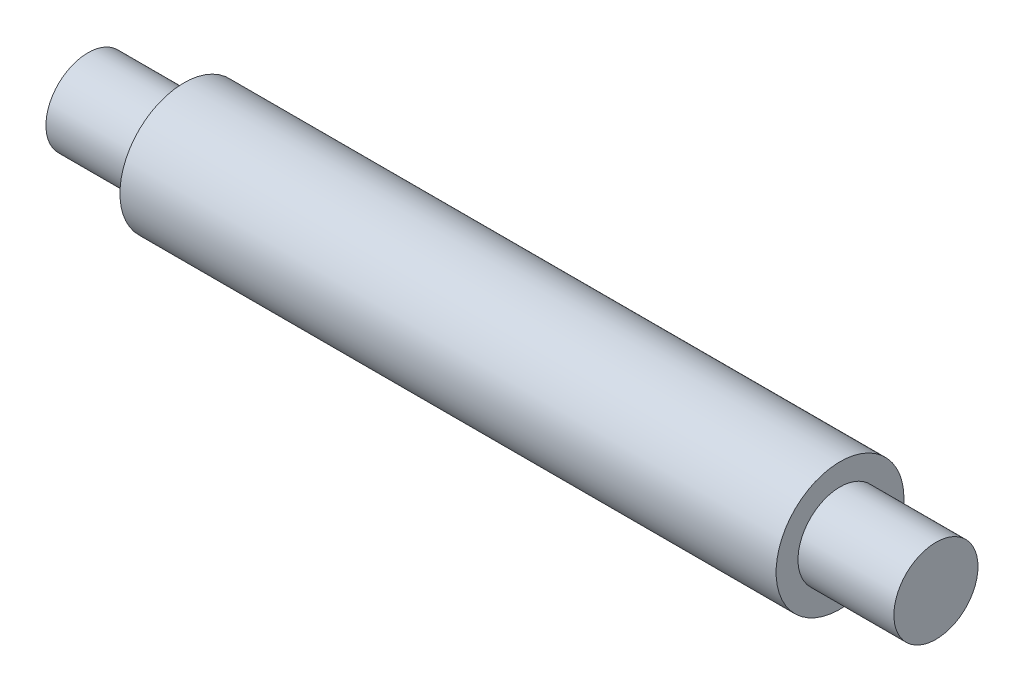
ISO-10303-21;
HEADER;
FILE_DESCRIPTION(('STEP AP214'),'2;1');
FILE_NAME('part.step','',(''),(''),'','','');
FILE_SCHEMA(('AUTOMOTIVE_DESIGN { 1 0 10303 214 1 1 1 1 }'));
ENDSEC;
DATA;
#1=APPLICATION_CONTEXT('core data for automotive mechanical design processes');
#2=APPLICATION_PROTOCOL_DEFINITION('international standard','automotive_design',2000,#1);
#3=PRODUCT_CONTEXT('',#1,'mechanical');
#4=PRODUCT('Part','Part','',(#3));
#5=PRODUCT_RELATED_PRODUCT_CATEGORY('part','',(#4));
#6=PRODUCT_DEFINITION_FORMATION('','',#4);
#7=PRODUCT_DEFINITION_CONTEXT('part definition',#1,'design');
#8=PRODUCT_DEFINITION('design','',#6,#7);
#9=PRODUCT_DEFINITION_SHAPE('','',#8);
#10=(LENGTH_UNIT() NAMED_UNIT(*) SI_UNIT(.MILLI.,.METRE.));
#11=(NAMED_UNIT(*) PLANE_ANGLE_UNIT() SI_UNIT($,.RADIAN.));
#12=(NAMED_UNIT(*) SI_UNIT($,.STERADIAN.) SOLID_ANGLE_UNIT());
#13=UNCERTAINTY_MEASURE_WITH_UNIT(LENGTH_MEASURE(1.E-05),#10,'distance_accuracy_value','');
#14=(GEOMETRIC_REPRESENTATION_CONTEXT(3) GLOBAL_UNCERTAINTY_ASSIGNED_CONTEXT((#13)) GLOBAL_UNIT_ASSIGNED_CONTEXT((#10,
#11,#12)) REPRESENTATION_CONTEXT('',''));
#15=CARTESIAN_POINT('',(0.,0.,0.));
#16=DIRECTION('',(0.,0.,1.));
#17=DIRECTION('',(1.,0.,0.));
#18=AXIS2_PLACEMENT_3D('',#15,#16,#17);
#19=CARTESIAN_POINT('',(-12.5,7.802709104713,-23.90155034102));
#20=DIRECTION('',(1.,0.,0.));
#21=DIRECTION('',(0.,0.,1.));
#22=AXIS2_PLACEMENT_3D('',#19,#20,#21);
#23=PLANE('',#22);
#24=CARTESIAN_POINT('',(-12.5,6.5,-22.60155034102));
#25=DIRECTION('',(1.,0.,0.));
#26=DIRECTION('',(0.,0.,-1.));
#27=AXIS2_PLACEMENT_3D('',#24,#25,#26);
#28=CIRCLE('',#27,1.25000000000001);
#29=CARTESIAN_POINT('',(-12.5,6.5,-23.85155034102));
#30=VERTEX_POINT('',#29);
#31=EDGE_CURVE('E19',#30,#30,#28,.F.);
#32=ORIENTED_EDGE('',*,*,#31,.T.);
#33=EDGE_LOOP('',(#32));
#34=FACE_BOUND('',#33,.T.);
#35=ADVANCED_FACE('F15',(#34),#23,.F.);
#36=CARTESIAN_POINT('',(-12.5,6.5,-22.60155034102));
#37=DIRECTION('',(1.,0.,0.));
#38=DIRECTION('',(0.,0.,-1.));
#39=AXIS2_PLACEMENT_3D('',#36,#37,#38);
#40=CYLINDRICAL_SURFACE('',#39,1.25000000000001);
#41=CARTESIAN_POINT('',(-9.65,6.5,-22.60155034102));
#42=DIRECTION('',(1.,0.,0.));
#43=DIRECTION('',(0.,0.,-1.));
#44=AXIS2_PLACEMENT_3D('',#41,#42,#43);
#45=CIRCLE('',#44,1.25000000000001);
#46=CARTESIAN_POINT('',(-9.65,6.5,-23.85155034102));
#47=VERTEX_POINT('',#46);
#48=EDGE_CURVE('E35',#47,#47,#45,.F.);
#49=ORIENTED_EDGE('',*,*,#48,.T.);
#50=EDGE_LOOP('',(#49));
#51=FACE_BOUND('',#50,.T.);
#52=ORIENTED_EDGE('',*,*,#31,.F.);
#53=EDGE_LOOP('',(#52));
#54=FACE_BOUND('',#53,.T.);
#55=ADVANCED_FACE('F43',(#51,#54),#40,.T.);
#56=CARTESIAN_POINT('',(-9.65,8.479131998468,-24.57755034102));
#57=DIRECTION('',(1.,0.,0.));
#58=DIRECTION('',(0.,0.,1.));
#59=AXIS2_PLACEMENT_3D('',#56,#57,#58);
#60=PLANE('',#59);
#61=ORIENTED_EDGE('',*,*,#48,.F.);
#62=EDGE_LOOP('',(#61));
#63=FACE_BOUND('',#62,.T.);
#64=CARTESIAN_POINT('',(-9.65,6.5,-22.60155034102));
#65=DIRECTION('',(1.,0.,0.));
#66=DIRECTION('',(0.,0.,-1.));
#67=AXIS2_PLACEMENT_3D('',#64,#65,#66);
#68=CIRCLE('',#67,1.90000000000001);
#69=CARTESIAN_POINT('',(-9.65,6.5,-24.50155034102));
#70=VERTEX_POINT('',#69);
#71=EDGE_CURVE('E33',#70,#70,#68,.F.);
#72=ORIENTED_EDGE('',*,*,#71,.T.);
#73=EDGE_LOOP('',(#72));
#74=FACE_BOUND('',#73,.T.);
#75=ADVANCED_FACE('F45',(#63,#74),#60,.F.);
#76=CARTESIAN_POINT('',(-9.65,6.5,-22.60155034102));
#77=DIRECTION('',(1.,0.,0.));
#78=DIRECTION('',(0.,0.,-1.));
#79=AXIS2_PLACEMENT_3D('',#76,#77,#78);
#80=CYLINDRICAL_SURFACE('',#79,1.90000000000001);
#81=CARTESIAN_POINT('',(9.85,6.5,-22.60155034102));
#82=DIRECTION('',(1.,0.,0.));
#83=DIRECTION('',(0.,0.,-1.));
#84=AXIS2_PLACEMENT_3D('',#81,#82,#83);
#85=CIRCLE('',#84,1.90000000000001);
#86=CARTESIAN_POINT('',(9.85,6.5,-24.50155034102));
#87=VERTEX_POINT('',#86);
#88=EDGE_CURVE('E28',#87,#87,#85,.F.);
#89=ORIENTED_EDGE('',*,*,#88,.T.);
#90=EDGE_LOOP('',(#89));
#91=FACE_BOUND('',#90,.T.);
#92=ORIENTED_EDGE('',*,*,#71,.F.);
#93=EDGE_LOOP('',(#92));
#94=FACE_BOUND('',#93,.T.);
#95=ADVANCED_FACE('F52',(#91,#94),#80,.T.);
#96=CARTESIAN_POINT('',(9.85,8.479131998468,-24.57755034102));
#97=DIRECTION('',(1.,0.,0.));
#98=DIRECTION('',(0.,0.,1.));
#99=AXIS2_PLACEMENT_3D('',#96,#97,#98);
#100=PLANE('',#99);
#101=CARTESIAN_POINT('',(9.85,6.5,-22.60155034102));
#102=DIRECTION('',(1.,0.,0.));
#103=DIRECTION('',(0.,0.,-1.));
#104=AXIS2_PLACEMENT_3D('',#101,#102,#103);
#105=CIRCLE('',#104,1.25000000000001);
#106=CARTESIAN_POINT('',(9.85,6.5,-23.85155034102));
#107=VERTEX_POINT('',#106);
#108=EDGE_CURVE('E23',#107,#107,#105,.F.);
#109=ORIENTED_EDGE('',*,*,#108,.T.);
#110=EDGE_LOOP('',(#109));
#111=FACE_BOUND('',#110,.T.);
#112=ORIENTED_EDGE('',*,*,#88,.F.);
#113=EDGE_LOOP('',(#112));
#114=FACE_BOUND('',#113,.T.);
#115=ADVANCED_FACE('F63',(#111,#114),#100,.T.);
#116=CARTESIAN_POINT('',(9.85,6.5,-22.60155034102));
#117=DIRECTION('',(1.,0.,0.));
#118=DIRECTION('',(0.,0.,-1.));
#119=AXIS2_PLACEMENT_3D('',#116,#117,#118);
#120=CYLINDRICAL_SURFACE('',#119,1.25000000000001);
#121=CARTESIAN_POINT('',(12.7,6.5,-22.60155034102));
#122=DIRECTION('',(1.,0.,0.));
#123=DIRECTION('',(0.,0.,-1.));
#124=AXIS2_PLACEMENT_3D('',#121,#122,#123);
#125=CIRCLE('',#124,1.25000000000001);
#126=CARTESIAN_POINT('',(12.7,6.5,-23.85155034102));
#127=VERTEX_POINT('',#126);
#128=EDGE_CURVE('E10',#127,#127,#125,.F.);
#129=ORIENTED_EDGE('',*,*,#128,.T.);
#130=EDGE_LOOP('',(#129));
#131=FACE_BOUND('',#130,.T.);
#132=ORIENTED_EDGE('',*,*,#108,.F.);
#133=EDGE_LOOP('',(#132));
#134=FACE_BOUND('',#133,.T.);
#135=ADVANCED_FACE('F58',(#131,#134),#120,.T.);
#136=CARTESIAN_POINT('',(12.7,7.802709104713,-23.90155034102));
#137=DIRECTION('',(1.,0.,0.));
#138=DIRECTION('',(0.,0.,1.));
#139=AXIS2_PLACEMENT_3D('',#136,#137,#138);
#140=PLANE('',#139);
#141=ORIENTED_EDGE('',*,*,#128,.F.);
#142=EDGE_LOOP('',(#141));
#143=FACE_BOUND('',#142,.T.);
#144=ADVANCED_FACE('F17',(#143),#140,.T.);
#145=CLOSED_SHELL('',(#35,#55,#75,#95,#115,#135,#144));
#146=MANIFOLD_SOLID_BREP('B1',#145);
#147=ADVANCED_BREP_SHAPE_REPRESENTATION('',(#18,#146),#14);
#148=SHAPE_DEFINITION_REPRESENTATION(#9,#147);
ENDSEC;
END-ISO-10303-21;
